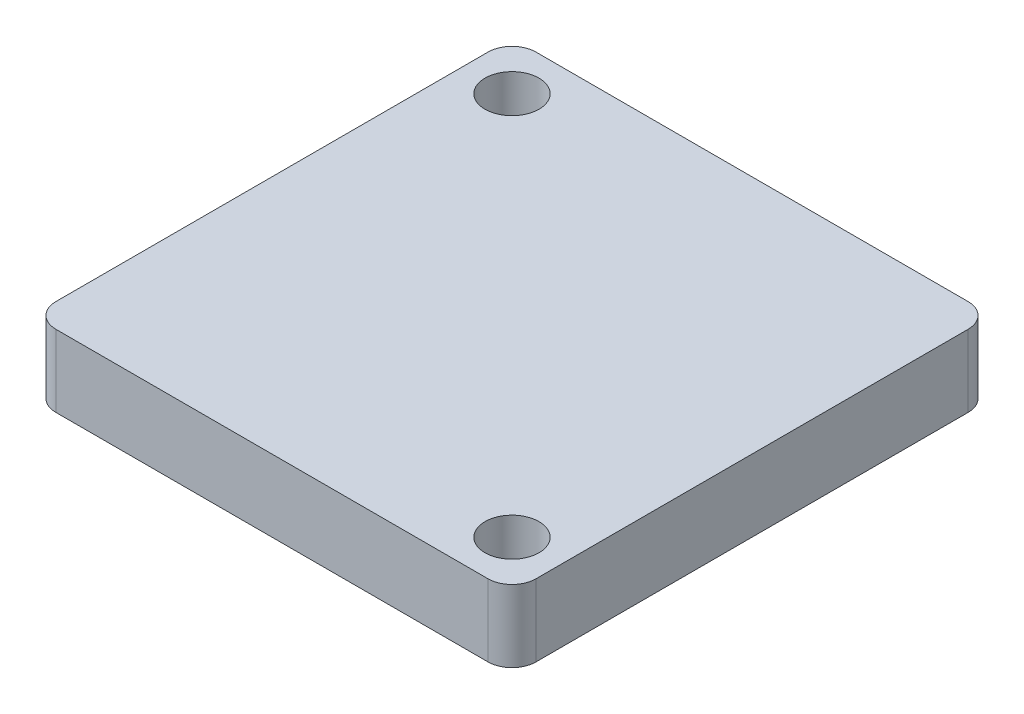
ISO-10303-21;
HEADER;
FILE_DESCRIPTION(('STEP AP214'),'2;1');
FILE_NAME('part.step','',(''),(''),'','','');
FILE_SCHEMA(('AUTOMOTIVE_DESIGN { 1 0 10303 214 1 1 1 1 }'));
ENDSEC;
DATA;
#1=APPLICATION_CONTEXT('core data for automotive mechanical design processes');
#2=APPLICATION_PROTOCOL_DEFINITION('international standard','automotive_design',2000,#1);
#3=PRODUCT_CONTEXT('',#1,'mechanical');
#4=PRODUCT('Part','Part','',(#3));
#5=PRODUCT_RELATED_PRODUCT_CATEGORY('part','',(#4));
#6=PRODUCT_DEFINITION_FORMATION('','',#4);
#7=PRODUCT_DEFINITION_CONTEXT('part definition',#1,'design');
#8=PRODUCT_DEFINITION('design','',#6,#7);
#9=PRODUCT_DEFINITION_SHAPE('','',#8);
#10=(LENGTH_UNIT() NAMED_UNIT(*) SI_UNIT(.MILLI.,.METRE.));
#11=(NAMED_UNIT(*) PLANE_ANGLE_UNIT() SI_UNIT($,.RADIAN.));
#12=(NAMED_UNIT(*) SI_UNIT($,.STERADIAN.) SOLID_ANGLE_UNIT());
#13=UNCERTAINTY_MEASURE_WITH_UNIT(LENGTH_MEASURE(1.E-05),#10,'distance_accuracy_value','');
#14=(GEOMETRIC_REPRESENTATION_CONTEXT(3) GLOBAL_UNCERTAINTY_ASSIGNED_CONTEXT((#13)) GLOBAL_UNIT_ASSIGNED_CONTEXT((#10,
#11,#12)) REPRESENTATION_CONTEXT('',''));
#15=CARTESIAN_POINT('',(0.,0.,0.));
#16=DIRECTION('',(0.,0.,1.));
#17=DIRECTION('',(1.,0.,0.));
#18=AXIS2_PLACEMENT_3D('',#15,#16,#17);
#19=CARTESIAN_POINT('',(0.,6.,40.));
#20=DIRECTION('',(1.,0.,0.));
#21=DIRECTION('',(0.,0.,-1.));
#22=AXIS2_PLACEMENT_3D('',#19,#20,#21);
#23=PLANE('',#22);
#24=DIRECTION('',(0.,0.,-1.));
#25=VECTOR('',#24,1.);
#26=CARTESIAN_POINT('',(0.,6.,40.));
#27=LINE('',#26,#25);
#28=CARTESIAN_POINT('',(0.,6.,38.));
#29=VERTEX_POINT('',#28);
#30=CARTESIAN_POINT('',(0.,6.,2.));
#31=VERTEX_POINT('',#30);
#32=EDGE_CURVE('E160',#29,#31,#27,.T.);
#33=ORIENTED_EDGE('',*,*,#32,.T.);
#34=DIRECTION('',(0.,-1.,0.));
#35=VECTOR('',#34,1.);
#36=CARTESIAN_POINT('',(0.,6.,2.));
#37=LINE('',#36,#35);
#38=CARTESIAN_POINT('',(0.,0.,2.));
#39=VERTEX_POINT('',#38);
#40=EDGE_CURVE('E124',#31,#39,#37,.T.);
#41=ORIENTED_EDGE('',*,*,#40,.T.);
#42=DIRECTION('',(0.,0.,-1.));
#43=VECTOR('',#42,1.);
#44=CARTESIAN_POINT('',(0.,0.,40.));
#45=LINE('',#44,#43);
#46=CARTESIAN_POINT('',(0.,0.,38.));
#47=VERTEX_POINT('',#46);
#48=EDGE_CURVE('E109',#47,#39,#45,.T.);
#49=ORIENTED_EDGE('',*,*,#48,.F.);
#50=DIRECTION('',(0.,-1.,0.));
#51=VECTOR('',#50,1.);
#52=CARTESIAN_POINT('',(0.,6.,38.));
#53=LINE('',#52,#51);
#54=EDGE_CURVE('E121',#47,#29,#53,.F.);
#55=ORIENTED_EDGE('',*,*,#54,.T.);
#56=EDGE_LOOP('',(#33,#41,#49,#55));
#57=FACE_BOUND('',#56,.T.);
#58=ADVANCED_FACE('F39',(#57),#23,.F.);
#59=CARTESIAN_POINT('',(0.,0.,40.));
#60=DIRECTION('',(0.,1.,0.));
#61=DIRECTION('',(0.,0.,1.));
#62=AXIS2_PLACEMENT_3D('',#59,#60,#61);
#63=PLANE('',#62);
#64=CARTESIAN_POINT('',(36.,0.,36.));
#65=DIRECTION('',(0.,1.,0.));
#66=DIRECTION('',(0.,0.,1.));
#67=AXIS2_PLACEMENT_3D('',#64,#65,#66);
#68=CIRCLE('',#67,2.25);
#69=CARTESIAN_POINT('',(36.,0.,38.25));
#70=VERTEX_POINT('',#69);
#71=EDGE_CURVE('E315',#70,#70,#68,.T.);
#72=ORIENTED_EDGE('',*,*,#71,.T.);
#73=EDGE_LOOP('',(#72));
#74=FACE_BOUND('',#73,.T.);
#75=CARTESIAN_POINT('',(4.,0.,4.));
#76=DIRECTION('',(0.,1.,0.));
#77=DIRECTION('',(0.,0.,1.));
#78=AXIS2_PLACEMENT_3D('',#75,#76,#77);
#79=CIRCLE('',#78,2.25);
#80=CARTESIAN_POINT('',(4.,0.,6.25));
#81=VERTEX_POINT('',#80);
#82=EDGE_CURVE('E171',#81,#81,#79,.T.);
#83=ORIENTED_EDGE('',*,*,#82,.T.);
#84=EDGE_LOOP('',(#83));
#85=FACE_BOUND('',#84,.T.);
#86=ORIENTED_EDGE('',*,*,#48,.T.);
#87=CARTESIAN_POINT('',(2.,0.,2.));
#88=DIRECTION('',(0.,1.,0.));
#89=DIRECTION('',(0.,0.,1.));
#90=AXIS2_PLACEMENT_3D('',#87,#88,#89);
#91=CIRCLE('',#90,2.);
#92=CARTESIAN_POINT('',(2.,0.,0.));
#93=VERTEX_POINT('',#92);
#94=EDGE_CURVE('E136',#39,#93,#91,.F.);
#95=ORIENTED_EDGE('',*,*,#94,.T.);
#96=DIRECTION('',(1.,0.,0.));
#97=VECTOR('',#96,1.);
#98=CARTESIAN_POINT('',(0.,0.,0.));
#99=LINE('',#98,#97);
#100=CARTESIAN_POINT('',(38.,0.,0.));
#101=VERTEX_POINT('',#100);
#102=EDGE_CURVE('E168',#93,#101,#99,.T.);
#103=ORIENTED_EDGE('',*,*,#102,.T.);
#104=CARTESIAN_POINT('',(38.,0.,2.));
#105=DIRECTION('',(0.,1.,0.));
#106=DIRECTION('',(0.,0.,1.));
#107=AXIS2_PLACEMENT_3D('',#104,#105,#106);
#108=CIRCLE('',#107,2.);
#109=CARTESIAN_POINT('',(40.,0.,2.));
#110=VERTEX_POINT('',#109);
#111=EDGE_CURVE('E115',#101,#110,#108,.F.);
#112=ORIENTED_EDGE('',*,*,#111,.T.);
#113=DIRECTION('',(0.,0.,-1.));
#114=VECTOR('',#113,1.);
#115=CARTESIAN_POINT('',(40.,0.,40.));
#116=LINE('',#115,#114);
#117=CARTESIAN_POINT('',(40.,0.,38.));
#118=VERTEX_POINT('',#117);
#119=EDGE_CURVE('E125',#118,#110,#116,.T.);
#120=ORIENTED_EDGE('',*,*,#119,.F.);
#121=CARTESIAN_POINT('',(38.,0.,38.));
#122=DIRECTION('',(0.,1.,0.));
#123=DIRECTION('',(0.,0.,1.));
#124=AXIS2_PLACEMENT_3D('',#121,#122,#123);
#125=CIRCLE('',#124,2.);
#126=CARTESIAN_POINT('',(38.,0.,40.));
#127=VERTEX_POINT('',#126);
#128=EDGE_CURVE('E116',#118,#127,#125,.F.);
#129=ORIENTED_EDGE('',*,*,#128,.T.);
#130=DIRECTION('',(1.,0.,0.));
#131=VECTOR('',#130,1.);
#132=CARTESIAN_POINT('',(0.,0.,40.));
#133=LINE('',#132,#131);
#134=CARTESIAN_POINT('',(2.,0.,40.));
#135=VERTEX_POINT('',#134);
#136=EDGE_CURVE('E111',#135,#127,#133,.T.);
#137=ORIENTED_EDGE('',*,*,#136,.F.);
#138=CARTESIAN_POINT('',(2.,0.,38.));
#139=DIRECTION('',(0.,1.,0.));
#140=DIRECTION('',(0.,0.,1.));
#141=AXIS2_PLACEMENT_3D('',#138,#139,#140);
#142=CIRCLE('',#141,2.);
#143=EDGE_CURVE('E106',#135,#47,#142,.F.);
#144=ORIENTED_EDGE('',*,*,#143,.T.);
#145=EDGE_LOOP('',(#86,#95,#103,#112,#120,#129,#137,#144));
#146=FACE_BOUND('',#145,.T.);
#147=ADVANCED_FACE('F108',(#74,#85,#146),#63,.F.);
#148=CARTESIAN_POINT('',(40.,0.,40.));
#149=DIRECTION('',(-1.,0.,0.));
#150=DIRECTION('',(0.,0.,1.));
#151=AXIS2_PLACEMENT_3D('',#148,#149,#150);
#152=PLANE('',#151);
#153=ORIENTED_EDGE('',*,*,#119,.T.);
#154=DIRECTION('',(0.,1.,0.));
#155=VECTOR('',#154,1.);
#156=CARTESIAN_POINT('',(40.,0.,2.));
#157=LINE('',#156,#155);
#158=CARTESIAN_POINT('',(40.,6.,2.));
#159=VERTEX_POINT('',#158);
#160=EDGE_CURVE('E149',#110,#159,#157,.T.);
#161=ORIENTED_EDGE('',*,*,#160,.T.);
#162=DIRECTION('',(0.,0.,-1.));
#163=VECTOR('',#162,1.);
#164=CARTESIAN_POINT('',(40.,6.,40.));
#165=LINE('',#164,#163);
#166=CARTESIAN_POINT('',(40.,6.,38.));
#167=VERTEX_POINT('',#166);
#168=EDGE_CURVE('E162',#167,#159,#165,.T.);
#169=ORIENTED_EDGE('',*,*,#168,.F.);
#170=DIRECTION('',(0.,1.,0.));
#171=VECTOR('',#170,1.);
#172=CARTESIAN_POINT('',(40.,0.,38.));
#173=LINE('',#172,#171);
#174=EDGE_CURVE('E147',#167,#118,#173,.F.);
#175=ORIENTED_EDGE('',*,*,#174,.T.);
#176=EDGE_LOOP('',(#153,#161,#169,#175));
#177=FACE_BOUND('',#176,.T.);
#178=ADVANCED_FACE('F176',(#177),#152,.F.);
#179=CARTESIAN_POINT('',(40.,6.,40.));
#180=DIRECTION('',(0.,-1.,0.));
#181=DIRECTION('',(0.,0.,-1.));
#182=AXIS2_PLACEMENT_3D('',#179,#180,#181);
#183=PLANE('',#182);
#184=CARTESIAN_POINT('',(36.,6.,36.));
#185=DIRECTION('',(0.,1.,0.));
#186=DIRECTION('',(0.,0.,1.));
#187=AXIS2_PLACEMENT_3D('',#184,#185,#186);
#188=CIRCLE('',#187,2.25);
#189=CARTESIAN_POINT('',(36.,6.,38.25));
#190=VERTEX_POINT('',#189);
#191=EDGE_CURVE('E318',#190,#190,#188,.T.);
#192=ORIENTED_EDGE('',*,*,#191,.F.);
#193=EDGE_LOOP('',(#192));
#194=FACE_BOUND('',#193,.T.);
#195=CARTESIAN_POINT('',(4.,6.,4.));
#196=DIRECTION('',(0.,1.,0.));
#197=DIRECTION('',(0.,0.,1.));
#198=AXIS2_PLACEMENT_3D('',#195,#196,#197);
#199=CIRCLE('',#198,2.25);
#200=CARTESIAN_POINT('',(4.,6.,6.25));
#201=VERTEX_POINT('',#200);
#202=EDGE_CURVE('E320',#201,#201,#199,.T.);
#203=ORIENTED_EDGE('',*,*,#202,.F.);
#204=EDGE_LOOP('',(#203));
#205=FACE_BOUND('',#204,.T.);
#206=DIRECTION('',(-1.,0.,0.));
#207=VECTOR('',#206,1.);
#208=CARTESIAN_POINT('',(40.,6.,0.));
#209=LINE('',#208,#207);
#210=CARTESIAN_POINT('',(38.,6.,0.));
#211=VERTEX_POINT('',#210);
#212=CARTESIAN_POINT('',(2.,6.,0.));
#213=VERTEX_POINT('',#212);
#214=EDGE_CURVE('E164',#211,#213,#209,.T.);
#215=ORIENTED_EDGE('',*,*,#214,.T.);
#216=CARTESIAN_POINT('',(2.,6.,2.));
#217=DIRECTION('',(0.,-1.,0.));
#218=DIRECTION('',(0.,0.,-1.));
#219=AXIS2_PLACEMENT_3D('',#216,#217,#218);
#220=CIRCLE('',#219,2.);
#221=EDGE_CURVE('E145',#213,#31,#220,.F.);
#222=ORIENTED_EDGE('',*,*,#221,.T.);
#223=ORIENTED_EDGE('',*,*,#32,.F.);
#224=CARTESIAN_POINT('',(2.,6.,38.));
#225=DIRECTION('',(0.,-1.,0.));
#226=DIRECTION('',(0.,0.,-1.));
#227=AXIS2_PLACEMENT_3D('',#224,#225,#226);
#228=CIRCLE('',#227,2.);
#229=CARTESIAN_POINT('',(2.,6.,40.));
#230=VERTEX_POINT('',#229);
#231=EDGE_CURVE('E129',#29,#230,#228,.F.);
#232=ORIENTED_EDGE('',*,*,#231,.T.);
#233=DIRECTION('',(-1.,0.,0.));
#234=VECTOR('',#233,1.);
#235=CARTESIAN_POINT('',(40.,6.,40.));
#236=LINE('',#235,#234);
#237=CARTESIAN_POINT('',(38.,6.,40.));
#238=VERTEX_POINT('',#237);
#239=EDGE_CURVE('E155',#238,#230,#236,.T.);
#240=ORIENTED_EDGE('',*,*,#239,.F.);
#241=CARTESIAN_POINT('',(38.,6.,38.));
#242=DIRECTION('',(0.,-1.,0.));
#243=DIRECTION('',(0.,0.,-1.));
#244=AXIS2_PLACEMENT_3D('',#241,#242,#243);
#245=CIRCLE('',#244,2.);
#246=EDGE_CURVE('E62',#238,#167,#245,.F.);
#247=ORIENTED_EDGE('',*,*,#246,.T.);
#248=ORIENTED_EDGE('',*,*,#168,.T.);
#249=CARTESIAN_POINT('',(38.,6.,2.));
#250=DIRECTION('',(0.,-1.,0.));
#251=DIRECTION('',(0.,0.,-1.));
#252=AXIS2_PLACEMENT_3D('',#249,#250,#251);
#253=CIRCLE('',#252,2.);
#254=EDGE_CURVE('E54',#159,#211,#253,.F.);
#255=ORIENTED_EDGE('',*,*,#254,.T.);
#256=EDGE_LOOP('',(#215,#222,#223,#232,#240,#247,#248,#255));
#257=FACE_BOUND('',#256,.T.);
#258=ADVANCED_FACE('F159',(#194,#205,#257),#183,.F.);
#259=CARTESIAN_POINT('',(0.,0.,40.));
#260=DIRECTION('',(0.,0.,1.));
#261=DIRECTION('',(1.,0.,0.));
#262=AXIS2_PLACEMENT_3D('',#259,#260,#261);
#263=PLANE('',#262);
#264=ORIENTED_EDGE('',*,*,#239,.T.);
#265=DIRECTION('',(0.,-1.,0.));
#266=VECTOR('',#265,1.);
#267=CARTESIAN_POINT('',(2.,0.,40.));
#268=LINE('',#267,#266);
#269=EDGE_CURVE('E11',#230,#135,#268,.T.);
#270=ORIENTED_EDGE('',*,*,#269,.T.);
#271=ORIENTED_EDGE('',*,*,#136,.T.);
#272=DIRECTION('',(0.,1.,0.));
#273=VECTOR('',#272,1.);
#274=CARTESIAN_POINT('',(38.,6.,40.));
#275=LINE('',#274,#273);
#276=EDGE_CURVE('E47',#127,#238,#275,.T.);
#277=ORIENTED_EDGE('',*,*,#276,.T.);
#278=EDGE_LOOP('',(#264,#270,#271,#277));
#279=FACE_BOUND('',#278,.T.);
#280=ADVANCED_FACE('F154',(#279),#263,.T.);
#281=CARTESIAN_POINT('',(0.,0.,0.));
#282=DIRECTION('',(0.,0.,1.));
#283=DIRECTION('',(1.,0.,0.));
#284=AXIS2_PLACEMENT_3D('',#281,#282,#283);
#285=PLANE('',#284);
#286=ORIENTED_EDGE('',*,*,#102,.F.);
#287=DIRECTION('',(0.,-1.,0.));
#288=VECTOR('',#287,1.);
#289=CARTESIAN_POINT('',(2.,0.,0.));
#290=LINE('',#289,#288);
#291=EDGE_CURVE('E140',#93,#213,#290,.F.);
#292=ORIENTED_EDGE('',*,*,#291,.T.);
#293=ORIENTED_EDGE('',*,*,#214,.F.);
#294=DIRECTION('',(0.,1.,0.));
#295=VECTOR('',#294,1.);
#296=CARTESIAN_POINT('',(38.,0.,0.));
#297=LINE('',#296,#295);
#298=EDGE_CURVE('E138',#211,#101,#297,.F.);
#299=ORIENTED_EDGE('',*,*,#298,.T.);
#300=EDGE_LOOP('',(#286,#292,#293,#299));
#301=FACE_BOUND('',#300,.T.);
#302=ADVANCED_FACE('F183',(#301),#285,.F.);
#303=CARTESIAN_POINT('',(2.,6.,2.));
#304=DIRECTION('',(0.,-1.,0.));
#305=DIRECTION('',(0.,0.,-1.));
#306=AXIS2_PLACEMENT_3D('',#303,#304,#305);
#307=CYLINDRICAL_SURFACE('',#306,2.);
#308=ORIENTED_EDGE('',*,*,#221,.F.);
#309=ORIENTED_EDGE('',*,*,#291,.F.);
#310=ORIENTED_EDGE('',*,*,#94,.F.);
#311=ORIENTED_EDGE('',*,*,#40,.F.);
#312=EDGE_LOOP('',(#308,#309,#310,#311));
#313=FACE_BOUND('',#312,.T.);
#314=ADVANCED_FACE('F187',(#313),#307,.T.);
#315=CARTESIAN_POINT('',(38.,0.,2.));
#316=DIRECTION('',(0.,1.,0.));
#317=DIRECTION('',(0.,0.,1.));
#318=AXIS2_PLACEMENT_3D('',#315,#316,#317);
#319=CYLINDRICAL_SURFACE('',#318,2.);
#320=ORIENTED_EDGE('',*,*,#111,.F.);
#321=ORIENTED_EDGE('',*,*,#298,.F.);
#322=ORIENTED_EDGE('',*,*,#254,.F.);
#323=ORIENTED_EDGE('',*,*,#160,.F.);
#324=EDGE_LOOP('',(#320,#321,#322,#323));
#325=FACE_BOUND('',#324,.T.);
#326=ADVANCED_FACE('F179',(#325),#319,.T.);
#327=CARTESIAN_POINT('',(2.,0.,38.));
#328=DIRECTION('',(0.,1.,0.));
#329=DIRECTION('',(0.,0.,1.));
#330=AXIS2_PLACEMENT_3D('',#327,#328,#329);
#331=CYLINDRICAL_SURFACE('',#330,2.);
#332=ORIENTED_EDGE('',*,*,#231,.F.);
#333=ORIENTED_EDGE('',*,*,#54,.F.);
#334=ORIENTED_EDGE('',*,*,#143,.F.);
#335=ORIENTED_EDGE('',*,*,#269,.F.);
#336=EDGE_LOOP('',(#332,#333,#334,#335));
#337=FACE_BOUND('',#336,.T.);
#338=ADVANCED_FACE('F128',(#337),#331,.T.);
#339=CARTESIAN_POINT('',(38.,0.,38.));
#340=DIRECTION('',(0.,-1.,0.));
#341=DIRECTION('',(0.,0.,-1.));
#342=AXIS2_PLACEMENT_3D('',#339,#340,#341);
#343=CYLINDRICAL_SURFACE('',#342,2.);
#344=ORIENTED_EDGE('',*,*,#128,.F.);
#345=ORIENTED_EDGE('',*,*,#174,.F.);
#346=ORIENTED_EDGE('',*,*,#246,.F.);
#347=ORIENTED_EDGE('',*,*,#276,.F.);
#348=EDGE_LOOP('',(#344,#345,#346,#347));
#349=FACE_BOUND('',#348,.T.);
#350=ADVANCED_FACE('F41',(#349),#343,.T.);
#351=CARTESIAN_POINT('',(4.,0.,4.));
#352=DIRECTION('',(0.,1.,0.));
#353=DIRECTION('',(0.,0.,1.));
#354=AXIS2_PLACEMENT_3D('',#351,#352,#353);
#355=CYLINDRICAL_SURFACE('',#354,2.25);
#356=ORIENTED_EDGE('',*,*,#82,.F.);
#357=EDGE_LOOP('',(#356));
#358=FACE_BOUND('',#357,.T.);
#359=ORIENTED_EDGE('',*,*,#202,.T.);
#360=EDGE_LOOP('',(#359));
#361=FACE_BOUND('',#360,.T.);
#362=ADVANCED_FACE('F189',(#358,#361),#355,.F.);
#363=CARTESIAN_POINT('',(36.,0.,36.));
#364=DIRECTION('',(0.,1.,0.));
#365=DIRECTION('',(0.,0.,1.));
#366=AXIS2_PLACEMENT_3D('',#363,#364,#365);
#367=CYLINDRICAL_SURFACE('',#366,2.25);
#368=ORIENTED_EDGE('',*,*,#71,.F.);
#369=EDGE_LOOP('',(#368));
#370=FACE_BOUND('',#369,.T.);
#371=ORIENTED_EDGE('',*,*,#191,.T.);
#372=EDGE_LOOP('',(#371));
#373=FACE_BOUND('',#372,.T.);
#374=ADVANCED_FACE('F194',(#370,#373),#367,.F.);
#375=CLOSED_SHELL('',(#58,#147,#178,#258,#280,#302,#314,#326,#338,#350,#362,#374));
#376=MANIFOLD_SOLID_BREP('B2',#375);
#377=ADVANCED_BREP_SHAPE_REPRESENTATION('',(#18,#376),#14);
#378=SHAPE_DEFINITION_REPRESENTATION(#9,#377);
ENDSEC;
END-ISO-10303-21;
